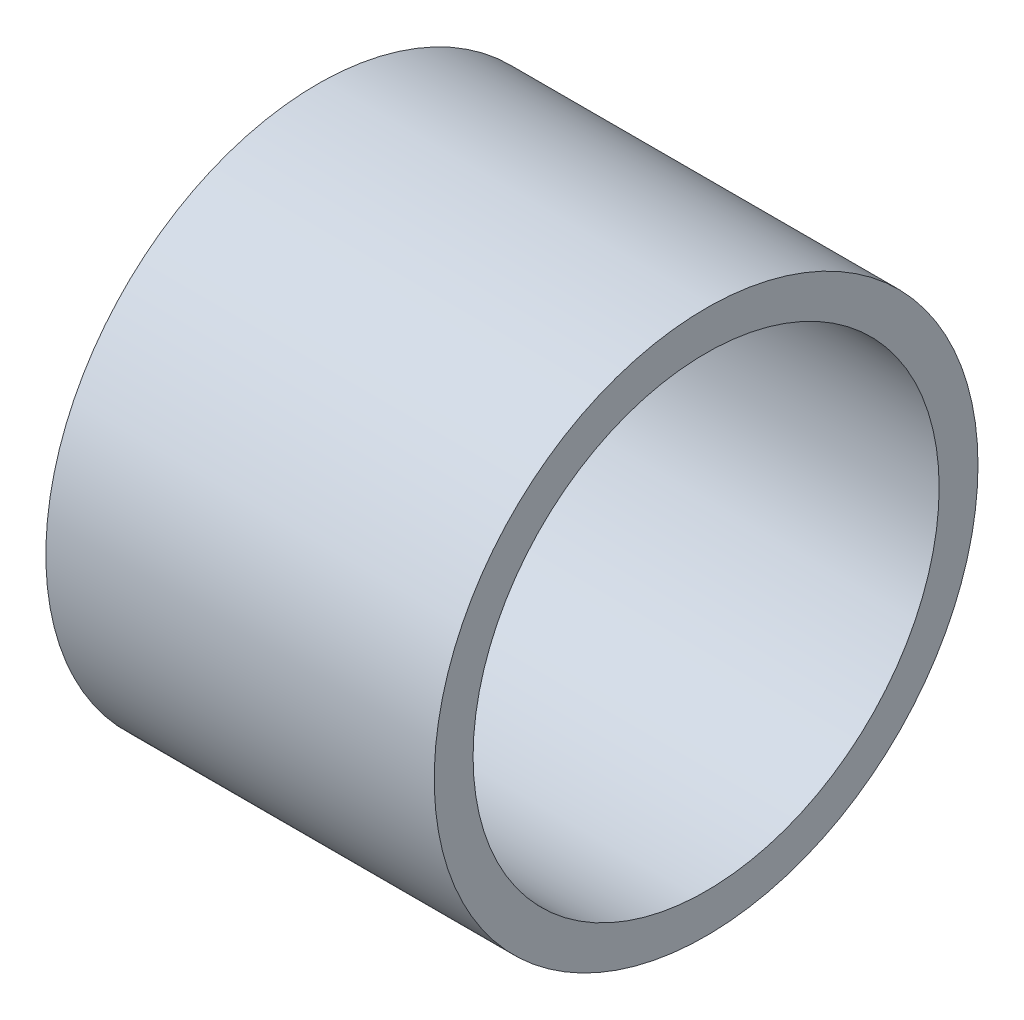
ISO-10303-21;
HEADER;
FILE_DESCRIPTION(('STEP AP214'),'2;1');
FILE_NAME('part.step','',(''),(''),'','','');
FILE_SCHEMA(('AUTOMOTIVE_DESIGN { 1 0 10303 214 1 1 1 1 }'));
ENDSEC;
DATA;
#1=APPLICATION_CONTEXT('core data for automotive mechanical design processes');
#2=APPLICATION_PROTOCOL_DEFINITION('international standard','automotive_design',2000,#1);
#3=PRODUCT_CONTEXT('',#1,'mechanical');
#4=PRODUCT('Part','Part','',(#3));
#5=PRODUCT_RELATED_PRODUCT_CATEGORY('part','',(#4));
#6=PRODUCT_DEFINITION_FORMATION('','',#4);
#7=PRODUCT_DEFINITION_CONTEXT('part definition',#1,'design');
#8=PRODUCT_DEFINITION('design','',#6,#7);
#9=PRODUCT_DEFINITION_SHAPE('','',#8);
#10=(LENGTH_UNIT() NAMED_UNIT(*) SI_UNIT(.MILLI.,.METRE.));
#11=(NAMED_UNIT(*) PLANE_ANGLE_UNIT() SI_UNIT($,.RADIAN.));
#12=(NAMED_UNIT(*) SI_UNIT($,.STERADIAN.) SOLID_ANGLE_UNIT());
#13=UNCERTAINTY_MEASURE_WITH_UNIT(LENGTH_MEASURE(1.E-05),#10,'distance_accuracy_value','');
#14=(GEOMETRIC_REPRESENTATION_CONTEXT(3) GLOBAL_UNCERTAINTY_ASSIGNED_CONTEXT((#13)) GLOBAL_UNIT_ASSIGNED_CONTEXT((#10,
#11,#12)) REPRESENTATION_CONTEXT('',''));
#15=CARTESIAN_POINT('',(0.,0.,0.));
#16=DIRECTION('',(0.,0.,1.));
#17=DIRECTION('',(1.,0.,0.));
#18=AXIS2_PLACEMENT_3D('',#15,#16,#17);
#19=CARTESIAN_POINT('',(5.,0.,0.));
#20=DIRECTION('',(1.,0.,0.));
#21=DIRECTION('',(0.,0.,-1.));
#22=AXIS2_PLACEMENT_3D('',#19,#20,#21);
#23=PLANE('',#22);
#24=CARTESIAN_POINT('',(5.,0.,0.));
#25=DIRECTION('',(1.,0.,0.));
#26=DIRECTION('',(0.,0.,-1.));
#27=AXIS2_PLACEMENT_3D('',#24,#25,#26);
#28=CIRCLE('',#27,3.5);
#29=CARTESIAN_POINT('',(5.,0.,-3.5));
#30=VERTEX_POINT('',#29);
#31=EDGE_CURVE('E10',#30,#30,#28,.T.);
#32=ORIENTED_EDGE('',*,*,#31,.T.);
#33=EDGE_LOOP('',(#32));
#34=FACE_BOUND('',#33,.T.);
#35=CARTESIAN_POINT('',(5.,0.,0.));
#36=DIRECTION('',(1.,0.,0.));
#37=DIRECTION('',(0.,0.,-1.));
#38=AXIS2_PLACEMENT_3D('',#35,#36,#37);
#39=CIRCLE('',#38,3.);
#40=CARTESIAN_POINT('',(5.,0.,-3.));
#41=VERTEX_POINT('',#40);
#42=EDGE_CURVE('E50',#41,#41,#39,.T.);
#43=ORIENTED_EDGE('',*,*,#42,.F.);
#44=EDGE_LOOP('',(#43));
#45=FACE_BOUND('',#44,.T.);
#46=ADVANCED_FACE('F37',(#34,#45),#23,.T.);
#47=CARTESIAN_POINT('',(0.,0.,0.));
#48=DIRECTION('',(1.,0.,0.));
#49=DIRECTION('',(0.,0.,-1.));
#50=AXIS2_PLACEMENT_3D('',#47,#48,#49);
#51=PLANE('',#50);
#52=CARTESIAN_POINT('',(0.,0.,0.));
#53=DIRECTION('',(1.,0.,0.));
#54=DIRECTION('',(0.,0.,-1.));
#55=AXIS2_PLACEMENT_3D('',#52,#53,#54);
#56=CIRCLE('',#55,3.5);
#57=CARTESIAN_POINT('',(0.,0.,-3.5));
#58=VERTEX_POINT('',#57);
#59=EDGE_CURVE('E41',#58,#58,#56,.T.);
#60=ORIENTED_EDGE('',*,*,#59,.F.);
#61=EDGE_LOOP('',(#60));
#62=FACE_BOUND('',#61,.T.);
#63=CARTESIAN_POINT('',(0.,0.,0.));
#64=DIRECTION('',(1.,0.,0.));
#65=DIRECTION('',(0.,0.,-1.));
#66=AXIS2_PLACEMENT_3D('',#63,#64,#65);
#67=CIRCLE('',#66,3.);
#68=CARTESIAN_POINT('',(0.,0.,-3.));
#69=VERTEX_POINT('',#68);
#70=EDGE_CURVE('E52',#69,#69,#67,.T.);
#71=ORIENTED_EDGE('',*,*,#70,.T.);
#72=EDGE_LOOP('',(#71));
#73=FACE_BOUND('',#72,.T.);
#74=ADVANCED_FACE('F64',(#62,#73),#51,.F.);
#75=CARTESIAN_POINT('',(5.,0.,0.));
#76=DIRECTION('',(-1.,0.,0.));
#77=DIRECTION('',(0.,0.,1.));
#78=AXIS2_PLACEMENT_3D('',#75,#76,#77);
#79=CYLINDRICAL_SURFACE('',#78,3.5);
#80=ORIENTED_EDGE('',*,*,#31,.F.);
#81=EDGE_LOOP('',(#80));
#82=FACE_BOUND('',#81,.T.);
#83=ORIENTED_EDGE('',*,*,#59,.T.);
#84=EDGE_LOOP('',(#83));
#85=FACE_BOUND('',#84,.T.);
#86=ADVANCED_FACE('F39',(#82,#85),#79,.T.);
#87=CARTESIAN_POINT('',(5.,0.,0.));
#88=DIRECTION('',(-1.,0.,0.));
#89=DIRECTION('',(0.,0.,1.));
#90=AXIS2_PLACEMENT_3D('',#87,#88,#89);
#91=CYLINDRICAL_SURFACE('',#90,3.);
#92=ORIENTED_EDGE('',*,*,#42,.T.);
#93=EDGE_LOOP('',(#92));
#94=FACE_BOUND('',#93,.T.);
#95=ORIENTED_EDGE('',*,*,#70,.F.);
#96=EDGE_LOOP('',(#95));
#97=FACE_BOUND('',#96,.T.);
#98=ADVANCED_FACE('F60',(#94,#97),#91,.F.);
#99=CLOSED_SHELL('',(#46,#74,#86,#98));
#100=MANIFOLD_SOLID_BREP('B2',#99);
#101=ADVANCED_BREP_SHAPE_REPRESENTATION('',(#18,#100),#14);
#102=SHAPE_DEFINITION_REPRESENTATION(#9,#101);
ENDSEC;
END-ISO-10303-21;
